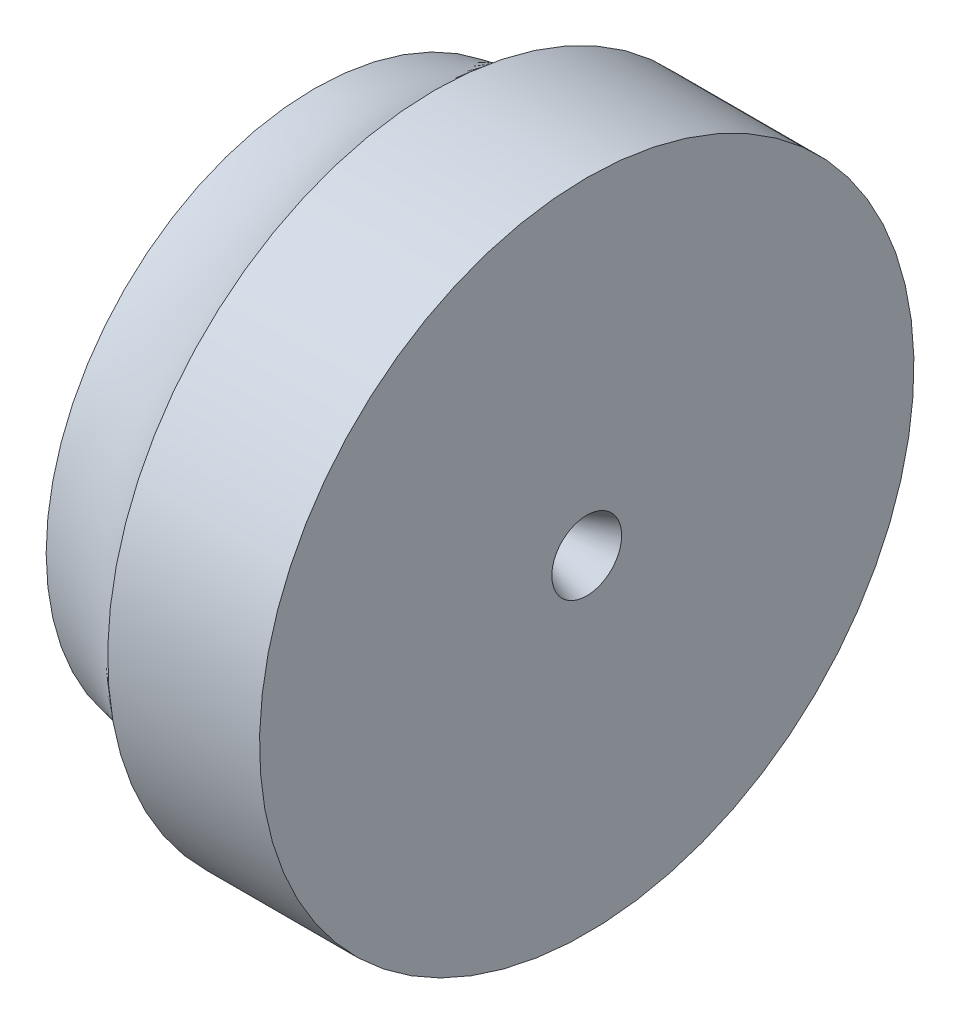
ISO-10303-21;
HEADER;
FILE_DESCRIPTION(('STEP AP214'),'2;1');
FILE_NAME('part.step','',(''),(''),'','','');
FILE_SCHEMA(('AUTOMOTIVE_DESIGN { 1 0 10303 214 1 1 1 1 }'));
ENDSEC;
DATA;
#1=APPLICATION_CONTEXT('core data for automotive mechanical design processes');
#2=APPLICATION_PROTOCOL_DEFINITION('international standard','automotive_design',2000,#1);
#3=PRODUCT_CONTEXT('',#1,'mechanical');
#4=PRODUCT('Part','Part','',(#3));
#5=PRODUCT_RELATED_PRODUCT_CATEGORY('part','',(#4));
#6=PRODUCT_DEFINITION_FORMATION('','',#4);
#7=PRODUCT_DEFINITION_CONTEXT('part definition',#1,'design');
#8=PRODUCT_DEFINITION('design','',#6,#7);
#9=PRODUCT_DEFINITION_SHAPE('','',#8);
#10=(LENGTH_UNIT() NAMED_UNIT(*) SI_UNIT(.MILLI.,.METRE.));
#11=(NAMED_UNIT(*) PLANE_ANGLE_UNIT() SI_UNIT($,.RADIAN.));
#12=(NAMED_UNIT(*) SI_UNIT($,.STERADIAN.) SOLID_ANGLE_UNIT());
#13=UNCERTAINTY_MEASURE_WITH_UNIT(LENGTH_MEASURE(1.E-05),#10,'distance_accuracy_value','');
#14=(GEOMETRIC_REPRESENTATION_CONTEXT(3) GLOBAL_UNCERTAINTY_ASSIGNED_CONTEXT((#13)) GLOBAL_UNIT_ASSIGNED_CONTEXT((#10,
#11,#12)) REPRESENTATION_CONTEXT('',''));
#15=CARTESIAN_POINT('',(0.,0.,0.));
#16=DIRECTION('',(0.,0.,1.));
#17=DIRECTION('',(1.,0.,0.));
#18=AXIS2_PLACEMENT_3D('',#15,#16,#17);
#19=CARTESIAN_POINT('',(5.,0.,0.));
#20=DIRECTION('',(1.,0.,0.));
#21=DIRECTION('',(0.,1.,0.));
#22=AXIS2_PLACEMENT_3D('',#19,#20,#21);
#23=CONICAL_SURFACE('',#22,0.,0.380506377112365);
#24=CARTESIAN_POINT('',(15.,0.,0.));
#25=DIRECTION('',(1.,0.,0.));
#26=DIRECTION('',(0.,1.,0.));
#27=AXIS2_PLACEMENT_3D('',#24,#25,#26);
#28=CIRCLE('',#27,4.);
#29=CARTESIAN_POINT('',(15.,4.,0.));
#30=VERTEX_POINT('',#29);
#31=EDGE_CURVE('E11',#30,#30,#28,.T.);
#32=ORIENTED_EDGE('',*,*,#31,.T.);
#33=EDGE_LOOP('',(#32));
#34=FACE_BOUND('',#33,.T.);
#35=CARTESIAN_POINT('',(5.,0.,0.));
#36=VERTEX_POINT('',#35);
#37=VERTEX_LOOP('',#36);
#38=FACE_BOUND('',#37,.T.);
#39=ADVANCED_FACE('F39',(#34,#38),#23,.F.);
#40=CARTESIAN_POINT('',(15.,37.5,0.));
#41=DIRECTION('',(1.,0.,0.));
#42=DIRECTION('',(0.,1.,0.));
#43=AXIS2_PLACEMENT_3D('',#40,#41,#42);
#44=PLANE('',#43);
#45=CARTESIAN_POINT('',(15.,0.,0.));
#46=DIRECTION('',(1.,0.,0.));
#47=DIRECTION('',(0.,1.,0.));
#48=AXIS2_PLACEMENT_3D('',#45,#46,#47);
#49=CIRCLE('',#48,37.5);
#50=CARTESIAN_POINT('',(15.,37.5,0.));
#51=VERTEX_POINT('',#50);
#52=EDGE_CURVE('E46',#51,#51,#49,.T.);
#53=ORIENTED_EDGE('',*,*,#52,.T.);
#54=EDGE_LOOP('',(#53));
#55=FACE_BOUND('',#54,.T.);
#56=ORIENTED_EDGE('',*,*,#31,.F.);
#57=EDGE_LOOP('',(#56));
#58=FACE_BOUND('',#57,.T.);
#59=ADVANCED_FACE('F50',(#55,#58),#44,.T.);
#60=CARTESIAN_POINT('',(5.,0.,0.));
#61=DIRECTION('',(1.,0.,0.));
#62=DIRECTION('',(0.,1.,0.));
#63=AXIS2_PLACEMENT_3D('',#60,#61,#62);
#64=CYLINDRICAL_SURFACE('',#63,37.5);
#65=CARTESIAN_POINT('',(-2.40000020474694,0.,0.));
#66=DIRECTION('',(1.,0.,0.));
#67=DIRECTION('',(0.,1.,0.));
#68=AXIS2_PLACEMENT_3D('',#65,#66,#67);
#69=CIRCLE('',#68,37.5);
#70=CARTESIAN_POINT('',(-2.40000020474694,37.5,0.));
#71=VERTEX_POINT('',#70);
#72=EDGE_CURVE('E87',#71,#71,#69,.T.);
#73=ORIENTED_EDGE('',*,*,#72,.T.);
#74=EDGE_LOOP('',(#73));
#75=FACE_BOUND('',#74,.T.);
#76=ORIENTED_EDGE('',*,*,#52,.F.);
#77=EDGE_LOOP('',(#76));
#78=FACE_BOUND('',#77,.T.);
#79=ADVANCED_FACE('F55',(#75,#78),#64,.T.);
#80=CARTESIAN_POINT('',(-19.7533007365144,0.,0.));
#81=DIRECTION('',(1.,0.,0.));
#82=DIRECTION('',(0.,1.,0.));
#83=AXIS2_PLACEMENT_3D('',#80,#81,#82);
#84=TOROIDAL_SURFACE('',#83,55.4961929489033,25.);
#85=CARTESIAN_POINT('',(-16.2000002047469,0.,0.));
#86=DIRECTION('',(1.,0.,0.));
#87=DIRECTION('',(0.,1.,0.));
#88=AXIS2_PLACEMENT_3D('',#85,#86,#87);
#89=CIRCLE('',#88,30.7500002047469);
#90=CARTESIAN_POINT('',(-16.2000002047469,30.7500002047469,0.));
#91=VERTEX_POINT('',#90);
#92=EDGE_CURVE('E83',#91,#91,#89,.T.);
#93=ORIENTED_EDGE('',*,*,#92,.T.);
#94=EDGE_LOOP('',(#93));
#95=FACE_BOUND('',#94,.T.);
#96=ORIENTED_EDGE('',*,*,#72,.F.);
#97=EDGE_LOOP('',(#96));
#98=FACE_BOUND('',#97,.T.);
#99=ADVANCED_FACE('F62',(#95,#98),#84,.F.);
#100=CARTESIAN_POINT('',(-16.2000002047469,0.,0.));
#101=DIRECTION('',(-1.,0.,0.));
#102=DIRECTION('',(0.,-1.,0.));
#103=AXIS2_PLACEMENT_3D('',#100,#101,#102);
#104=CONICAL_SURFACE('',#103,30.7500002047469,0.785398163397447);
#105=CARTESIAN_POINT('',(0.,0.,0.));
#106=DIRECTION('',(1.,0.,0.));
#107=DIRECTION('',(0.,1.,0.));
#108=AXIS2_PLACEMENT_3D('',#105,#106,#107);
#109=CIRCLE('',#108,14.55);
#110=CARTESIAN_POINT('',(0.,14.55,0.));
#111=VERTEX_POINT('',#110);
#112=EDGE_CURVE('E81',#111,#111,#109,.T.);
#113=ORIENTED_EDGE('',*,*,#112,.T.);
#114=EDGE_LOOP('',(#113));
#115=FACE_BOUND('',#114,.T.);
#116=ORIENTED_EDGE('',*,*,#92,.F.);
#117=EDGE_LOOP('',(#116));
#118=FACE_BOUND('',#117,.T.);
#119=ADVANCED_FACE('F69',(#115,#118),#104,.F.);
#120=CARTESIAN_POINT('',(0.,0.,0.));
#121=DIRECTION('',(-1.,0.,0.));
#122=DIRECTION('',(0.,-1.,0.));
#123=AXIS2_PLACEMENT_3D('',#120,#121,#122);
#124=PLANE('',#123);
#125=ORIENTED_EDGE('',*,*,#112,.F.);
#126=EDGE_LOOP('',(#125));
#127=FACE_BOUND('',#126,.T.);
#128=ADVANCED_FACE('F73',(#127),#124,.T.);
#129=CLOSED_SHELL('',(#39,#59,#79,#99,#119,#128));
#130=MANIFOLD_SOLID_BREP('B2',#129);
#131=ADVANCED_BREP_SHAPE_REPRESENTATION('',(#18,#130),#14);
#132=SHAPE_DEFINITION_REPRESENTATION(#9,#131);
ENDSEC;
END-ISO-10303-21;
